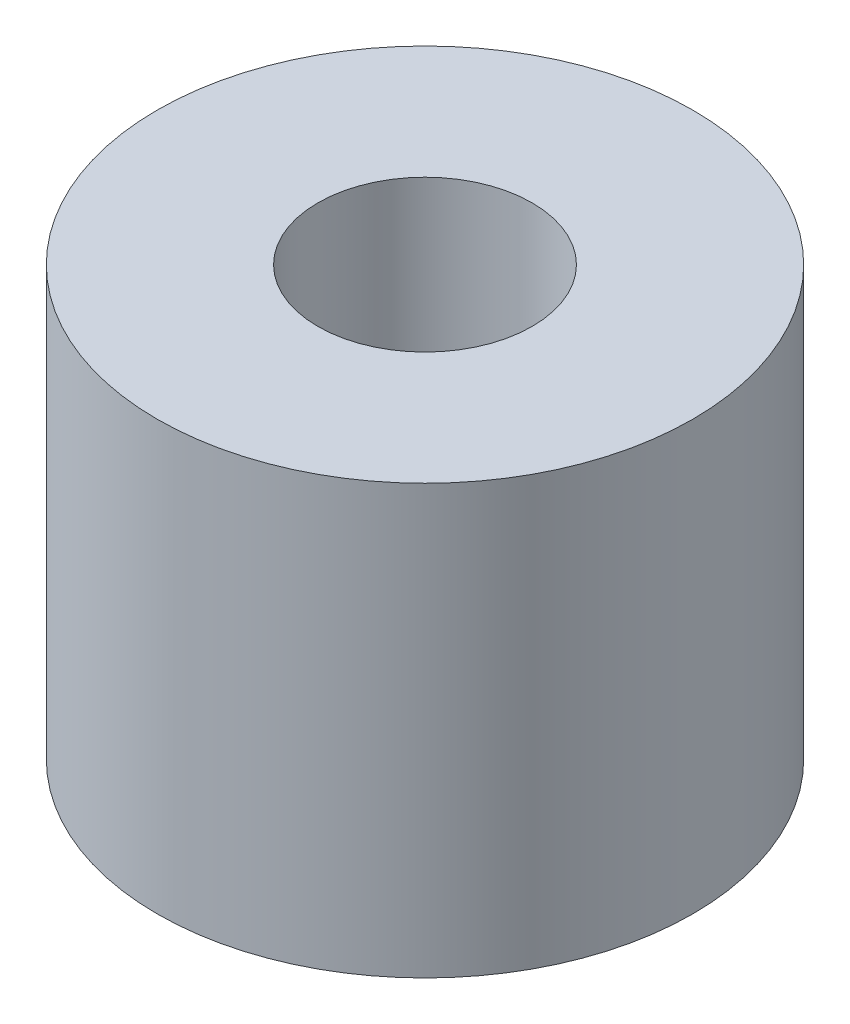
ISO-10303-21;
HEADER;
FILE_DESCRIPTION(('STEP AP214'),'2;1');
FILE_NAME('part.step','',(''),(''),'','','');
FILE_SCHEMA(('AUTOMOTIVE_DESIGN { 1 0 10303 214 1 1 1 1 }'));
ENDSEC;
DATA;
#1=APPLICATION_CONTEXT('core data for automotive mechanical design processes');
#2=APPLICATION_PROTOCOL_DEFINITION('international standard','automotive_design',2000,#1);
#3=PRODUCT_CONTEXT('',#1,'mechanical');
#4=PRODUCT('Part','Part','',(#3));
#5=PRODUCT_RELATED_PRODUCT_CATEGORY('part','',(#4));
#6=PRODUCT_DEFINITION_FORMATION('','',#4);
#7=PRODUCT_DEFINITION_CONTEXT('part definition',#1,'design');
#8=PRODUCT_DEFINITION('design','',#6,#7);
#9=PRODUCT_DEFINITION_SHAPE('','',#8);
#10=(LENGTH_UNIT() NAMED_UNIT(*) SI_UNIT(.MILLI.,.METRE.));
#11=(NAMED_UNIT(*) PLANE_ANGLE_UNIT() SI_UNIT($,.RADIAN.));
#12=(NAMED_UNIT(*) SI_UNIT($,.STERADIAN.) SOLID_ANGLE_UNIT());
#13=UNCERTAINTY_MEASURE_WITH_UNIT(LENGTH_MEASURE(1.E-05),#10,'distance_accuracy_value','');
#14=(GEOMETRIC_REPRESENTATION_CONTEXT(3) GLOBAL_UNCERTAINTY_ASSIGNED_CONTEXT((#13)) GLOBAL_UNIT_ASSIGNED_CONTEXT((#10,
#11,#12)) REPRESENTATION_CONTEXT('',''));
#15=CARTESIAN_POINT('',(0.,0.,0.));
#16=DIRECTION('',(0.,0.,1.));
#17=DIRECTION('',(1.,0.,0.));
#18=AXIS2_PLACEMENT_3D('',#15,#16,#17);
#19=CARTESIAN_POINT('',(0.,8.,0.));
#20=DIRECTION('',(0.,1.,0.));
#21=DIRECTION('',(0.,0.,1.));
#22=AXIS2_PLACEMENT_3D('',#19,#20,#21);
#23=PLANE('',#22);
#24=CARTESIAN_POINT('',(0.,8.,0.));
#25=DIRECTION('',(0.,1.,0.));
#26=DIRECTION('',(0.,0.,1.));
#27=AXIS2_PLACEMENT_3D('',#24,#25,#26);
#28=CIRCLE('',#27,5.);
#29=CARTESIAN_POINT('',(0.,8.,5.));
#30=VERTEX_POINT('',#29);
#31=EDGE_CURVE('E10',#30,#30,#28,.T.);
#32=ORIENTED_EDGE('',*,*,#31,.T.);
#33=EDGE_LOOP('',(#32));
#34=FACE_BOUND('',#33,.T.);
#35=CARTESIAN_POINT('',(0.,8.,0.));
#36=DIRECTION('',(0.,1.,0.));
#37=DIRECTION('',(0.,0.,1.));
#38=AXIS2_PLACEMENT_3D('',#35,#36,#37);
#39=CIRCLE('',#38,2.);
#40=CARTESIAN_POINT('',(0.,8.,2.));
#41=VERTEX_POINT('',#40);
#42=EDGE_CURVE('E45',#41,#41,#39,.T.);
#43=ORIENTED_EDGE('',*,*,#42,.F.);
#44=EDGE_LOOP('',(#43));
#45=FACE_BOUND('',#44,.T.);
#46=ADVANCED_FACE('F34',(#34,#45),#23,.T.);
#47=CARTESIAN_POINT('',(0.,0.,0.));
#48=DIRECTION('',(0.,1.,0.));
#49=DIRECTION('',(0.,0.,1.));
#50=AXIS2_PLACEMENT_3D('',#47,#48,#49);
#51=PLANE('',#50);
#52=CARTESIAN_POINT('',(0.,0.,0.));
#53=DIRECTION('',(0.,1.,0.));
#54=DIRECTION('',(0.,0.,1.));
#55=AXIS2_PLACEMENT_3D('',#52,#53,#54);
#56=CIRCLE('',#55,5.);
#57=CARTESIAN_POINT('',(0.,0.,5.));
#58=VERTEX_POINT('',#57);
#59=EDGE_CURVE('E38',#58,#58,#56,.T.);
#60=ORIENTED_EDGE('',*,*,#59,.F.);
#61=EDGE_LOOP('',(#60));
#62=FACE_BOUND('',#61,.T.);
#63=CARTESIAN_POINT('',(0.,0.,0.));
#64=DIRECTION('',(0.,1.,0.));
#65=DIRECTION('',(0.,0.,1.));
#66=AXIS2_PLACEMENT_3D('',#63,#64,#65);
#67=CIRCLE('',#66,2.);
#68=CARTESIAN_POINT('',(0.,0.,2.));
#69=VERTEX_POINT('',#68);
#70=EDGE_CURVE('E47',#69,#69,#67,.T.);
#71=ORIENTED_EDGE('',*,*,#70,.T.);
#72=EDGE_LOOP('',(#71));
#73=FACE_BOUND('',#72,.T.);
#74=ADVANCED_FACE('F57',(#62,#73),#51,.F.);
#75=CARTESIAN_POINT('',(0.,8.,0.));
#76=DIRECTION('',(0.,-1.,0.));
#77=DIRECTION('',(0.,0.,-1.));
#78=AXIS2_PLACEMENT_3D('',#75,#76,#77);
#79=CYLINDRICAL_SURFACE('',#78,5.);
#80=ORIENTED_EDGE('',*,*,#31,.F.);
#81=EDGE_LOOP('',(#80));
#82=FACE_BOUND('',#81,.T.);
#83=ORIENTED_EDGE('',*,*,#59,.T.);
#84=EDGE_LOOP('',(#83));
#85=FACE_BOUND('',#84,.T.);
#86=ADVANCED_FACE('F36',(#82,#85),#79,.T.);
#87=CARTESIAN_POINT('',(0.,8.,0.));
#88=DIRECTION('',(0.,-1.,0.));
#89=DIRECTION('',(0.,0.,-1.));
#90=AXIS2_PLACEMENT_3D('',#87,#88,#89);
#91=CYLINDRICAL_SURFACE('',#90,2.);
#92=ORIENTED_EDGE('',*,*,#42,.T.);
#93=EDGE_LOOP('',(#92));
#94=FACE_BOUND('',#93,.T.);
#95=ORIENTED_EDGE('',*,*,#70,.F.);
#96=EDGE_LOOP('',(#95));
#97=FACE_BOUND('',#96,.T.);
#98=ADVANCED_FACE('F53',(#94,#97),#91,.F.);
#99=CLOSED_SHELL('',(#46,#74,#86,#98));
#100=MANIFOLD_SOLID_BREP('B2',#99);
#101=ADVANCED_BREP_SHAPE_REPRESENTATION('',(#18,#100),#14);
#102=SHAPE_DEFINITION_REPRESENTATION(#9,#101);
ENDSEC;
END-ISO-10303-21;
